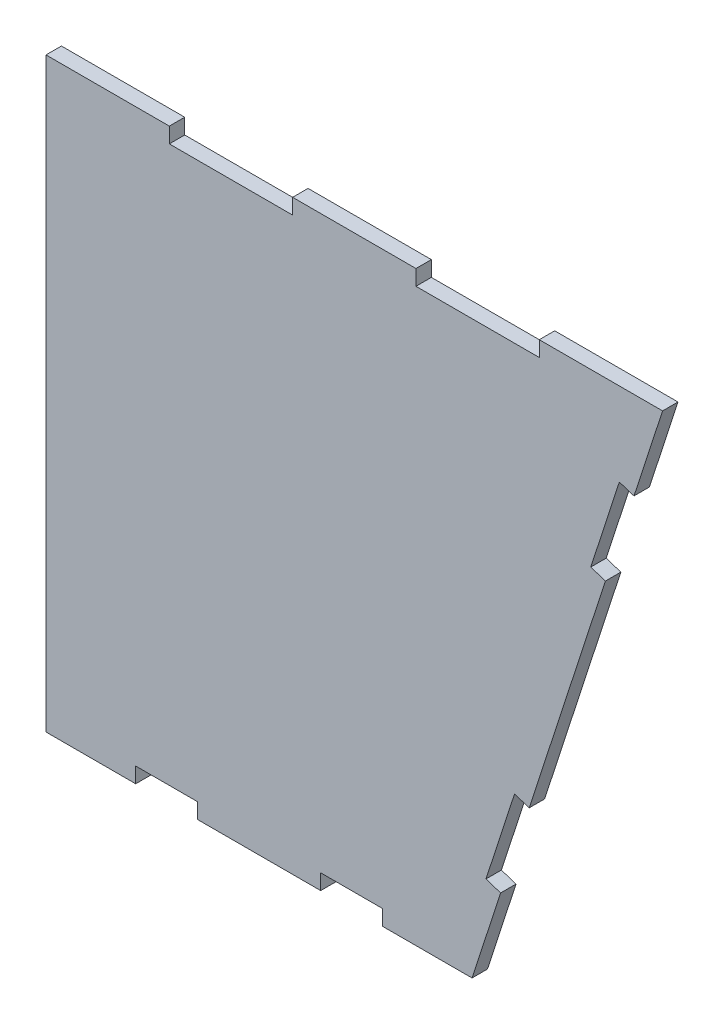
ISO-10303-21;
HEADER;
FILE_DESCRIPTION(('STEP AP214'),'2;1');
FILE_NAME('part.step','',(''),(''),'','','');
FILE_SCHEMA(('AUTOMOTIVE_DESIGN { 1 0 10303 214 1 1 1 1 }'));
ENDSEC;
DATA;
#1=APPLICATION_CONTEXT('core data for automotive mechanical design processes');
#2=APPLICATION_PROTOCOL_DEFINITION('international standard','automotive_design',2000,#1);
#3=PRODUCT_CONTEXT('',#1,'mechanical');
#4=PRODUCT('Part','Part','',(#3));
#5=PRODUCT_RELATED_PRODUCT_CATEGORY('part','',(#4));
#6=PRODUCT_DEFINITION_FORMATION('','',#4);
#7=PRODUCT_DEFINITION_CONTEXT('part definition',#1,'design');
#8=PRODUCT_DEFINITION('design','',#6,#7);
#9=PRODUCT_DEFINITION_SHAPE('','',#8);
#10=(LENGTH_UNIT() NAMED_UNIT(*) SI_UNIT(.MILLI.,.METRE.));
#11=(NAMED_UNIT(*) PLANE_ANGLE_UNIT() SI_UNIT($,.RADIAN.));
#12=(NAMED_UNIT(*) SI_UNIT($,.STERADIAN.) SOLID_ANGLE_UNIT());
#13=UNCERTAINTY_MEASURE_WITH_UNIT(LENGTH_MEASURE(1.E-05),#10,'distance_accuracy_value','');
#14=(GEOMETRIC_REPRESENTATION_CONTEXT(3) GLOBAL_UNCERTAINTY_ASSIGNED_CONTEXT((#13)) GLOBAL_UNIT_ASSIGNED_CONTEXT((#10,
#11,#12)) REPRESENTATION_CONTEXT('',''));
#15=CARTESIAN_POINT('',(0.,0.,0.));
#16=DIRECTION('',(0.,0.,1.));
#17=DIRECTION('',(1.,0.,0.));
#18=AXIS2_PLACEMENT_3D('',#15,#16,#17);
#19=CARTESIAN_POINT('',(-18.477420857191,0.,3.175));
#20=DIRECTION('',(0.,1.,0.));
#21=DIRECTION('',(0.,0.,1.));
#22=AXIS2_PLACEMENT_3D('',#19,#20,#21);
#23=PLANE('',#22);
#24=DIRECTION('',(1.,0.,0.));
#25=VECTOR('',#24,1.);
#26=CARTESIAN_POINT('',(-18.477420857191,0.,0.));
#27=LINE('',#26,#25);
#28=CARTESIAN_POINT('',(-18.477420857191,0.,0.));
#29=VERTEX_POINT('',#28);
#30=CARTESIAN_POINT('',(0.,0.,0.));
#31=VERTEX_POINT('',#30);
#32=EDGE_CURVE('E251',#29,#31,#27,.T.);
#33=ORIENTED_EDGE('',*,*,#32,.T.);
#34=DIRECTION('',(0.,0.,-1.));
#35=VECTOR('',#34,1.);
#36=CARTESIAN_POINT('',(0.,0.,3.175));
#37=LINE('',#36,#35);
#38=CARTESIAN_POINT('',(0.,0.,3.175));
#39=VERTEX_POINT('',#38);
#40=EDGE_CURVE('E11',#39,#31,#37,.T.);
#41=ORIENTED_EDGE('',*,*,#40,.F.);
#42=DIRECTION('',(1.,0.,0.));
#43=VECTOR('',#42,1.);
#44=CARTESIAN_POINT('',(-18.477420857191,0.,3.175));
#45=LINE('',#44,#43);
#46=CARTESIAN_POINT('',(-18.477420857191,0.,3.175));
#47=VERTEX_POINT('',#46);
#48=EDGE_CURVE('E305',#47,#39,#45,.T.);
#49=ORIENTED_EDGE('',*,*,#48,.F.);
#50=DIRECTION('',(0.,0.,-1.));
#51=VECTOR('',#50,1.);
#52=CARTESIAN_POINT('',(-18.477420857191,0.,3.175));
#53=LINE('',#52,#51);
#54=EDGE_CURVE('E247',#47,#29,#53,.T.);
#55=ORIENTED_EDGE('',*,*,#54,.T.);
#56=EDGE_LOOP('',(#33,#41,#49,#55));
#57=FACE_BOUND('',#56,.T.);
#58=ADVANCED_FACE('F35',(#57),#23,.F.);
#59=CARTESIAN_POINT('',(0.,0.,3.175));
#60=DIRECTION('',(-0.951056516295155,0.309016994374945,0.));
#61=DIRECTION('',(-0.309016994374945,-0.951056516295155,0.));
#62=AXIS2_PLACEMENT_3D('',#59,#60,#61);
#63=PLANE('',#62);
#64=DIRECTION('',(0.309016994374945,0.951056516295154,0.));
#65=VECTOR('',#64,1.);
#66=CARTESIAN_POINT('',(0.,0.,0.));
#67=LINE('',#66,#65);
#68=CARTESIAN_POINT('',(5.88677374284271,18.1176266354227,0.));
#69=VERTEX_POINT('',#68);
#70=EDGE_CURVE('E254',#31,#69,#67,.T.);
#71=ORIENTED_EDGE('',*,*,#70,.T.);
#72=DIRECTION('',(0.,0.,-1.));
#73=VECTOR('',#72,1.);
#74=CARTESIAN_POINT('',(5.88677374284271,18.1176266354227,3.175));
#75=LINE('',#74,#73);
#76=CARTESIAN_POINT('',(5.88677374284271,18.1176266354227,3.175));
#77=VERTEX_POINT('',#76);
#78=EDGE_CURVE('E43',#77,#69,#75,.T.);
#79=ORIENTED_EDGE('',*,*,#78,.F.);
#80=DIRECTION('',(0.309016994374945,0.951056516295154,0.));
#81=VECTOR('',#80,1.);
#82=CARTESIAN_POINT('',(0.,0.,3.175));
#83=LINE('',#82,#81);
#84=EDGE_CURVE('E154',#39,#77,#83,.T.);
#85=ORIENTED_EDGE('',*,*,#84,.F.);
#86=ORIENTED_EDGE('',*,*,#40,.T.);
#87=EDGE_LOOP('',(#71,#79,#85,#86));
#88=FACE_BOUND('',#87,.T.);
#89=ADVANCED_FACE('F463',(#88),#63,.F.);
#90=CARTESIAN_POINT('',(5.88677374284271,18.1176266354227,3.175));
#91=DIRECTION('',(-0.309016994374942,-0.951056516295155,0.));
#92=DIRECTION('',(0.951056516295155,-0.309016994374942,0.));
#93=AXIS2_PLACEMENT_3D('',#90,#91,#92);
#94=PLANE('',#93);
#95=DIRECTION('',(-0.951056516295155,0.309016994374942,0.));
#96=VECTOR('',#95,1.);
#97=CARTESIAN_POINT('',(5.88677374284271,18.1176266354227,0.));
#98=LINE('',#97,#96);
#99=CARTESIAN_POINT('',(2.86716930360559,19.0987555925632,0.));
#100=VERTEX_POINT('',#99);
#101=EDGE_CURVE('E256',#69,#100,#98,.T.);
#102=ORIENTED_EDGE('',*,*,#101,.T.);
#103=DIRECTION('',(0.,0.,-1.));
#104=VECTOR('',#103,1.);
#105=CARTESIAN_POINT('',(2.86716930360559,19.0987555925632,3.175));
#106=LINE('',#105,#104);
#107=CARTESIAN_POINT('',(2.86716930360559,19.0987555925632,3.175));
#108=VERTEX_POINT('',#107);
#109=EDGE_CURVE('E372',#108,#100,#106,.T.);
#110=ORIENTED_EDGE('',*,*,#109,.F.);
#111=DIRECTION('',(-0.951056516295155,0.309016994374942,0.));
#112=VECTOR('',#111,1.);
#113=CARTESIAN_POINT('',(5.88677374284271,18.1176266354227,3.175));
#114=LINE('',#113,#112);
#115=EDGE_CURVE('E380',#77,#108,#114,.T.);
#116=ORIENTED_EDGE('',*,*,#115,.F.);
#117=ORIENTED_EDGE('',*,*,#78,.T.);
#118=EDGE_LOOP('',(#102,#110,#116,#117));
#119=FACE_BOUND('',#118,.T.);
#120=ADVANCED_FACE('F378',(#119),#94,.F.);
#121=CARTESIAN_POINT('',(2.86716930360559,19.0987555925632,3.175));
#122=DIRECTION('',(-0.951056516295154,0.309016994374946,0.));
#123=DIRECTION('',(-0.309016994374946,-0.951056516295154,0.));
#124=AXIS2_PLACEMENT_3D('',#121,#122,#123);
#125=PLANE('',#124);
#126=DIRECTION('',(0.309016994374946,0.951056516295154,0.));
#127=VECTOR('',#126,1.);
#128=CARTESIAN_POINT('',(2.86716930360559,19.0987555925632,0.));
#129=LINE('',#128,#127);
#130=CARTESIAN_POINT('',(8.75394304644831,37.2163822279859,0.));
#131=VERTEX_POINT('',#130);
#132=EDGE_CURVE('E258',#100,#131,#129,.T.);
#133=ORIENTED_EDGE('',*,*,#132,.T.);
#134=DIRECTION('',(0.,0.,-1.));
#135=VECTOR('',#134,1.);
#136=CARTESIAN_POINT('',(8.75394304644831,37.2163822279859,3.175));
#137=LINE('',#136,#135);
#138=CARTESIAN_POINT('',(8.75394304644831,37.2163822279859,3.175));
#139=VERTEX_POINT('',#138);
#140=EDGE_CURVE('E369',#139,#131,#137,.T.);
#141=ORIENTED_EDGE('',*,*,#140,.F.);
#142=DIRECTION('',(0.309016994374946,0.951056516295154,0.));
#143=VECTOR('',#142,1.);
#144=CARTESIAN_POINT('',(2.86716930360559,19.0987555925632,3.175));
#145=LINE('',#144,#143);
#146=EDGE_CURVE('E398',#108,#139,#145,.T.);
#147=ORIENTED_EDGE('',*,*,#146,.F.);
#148=ORIENTED_EDGE('',*,*,#109,.T.);
#149=EDGE_LOOP('',(#133,#141,#147,#148));
#150=FACE_BOUND('',#149,.T.);
#151=ADVANCED_FACE('F389',(#150),#125,.F.);
#152=CARTESIAN_POINT('',(8.75394304644831,37.2163822279859,3.175));
#153=DIRECTION('',(0.309016994374942,0.951056516295155,0.));
#154=DIRECTION('',(-0.951056516295155,0.309016994374942,0.));
#155=AXIS2_PLACEMENT_3D('',#152,#153,#154);
#156=PLANE('',#155);
#157=DIRECTION('',(0.951056516295155,-0.309016994374942,0.));
#158=VECTOR('',#157,1.);
#159=CARTESIAN_POINT('',(8.75394304644831,37.2163822279859,0.));
#160=LINE('',#159,#158);
#161=CARTESIAN_POINT('',(11.7735474856854,36.2352532708454,0.));
#162=VERTEX_POINT('',#161);
#163=EDGE_CURVE('E260',#131,#162,#160,.T.);
#164=ORIENTED_EDGE('',*,*,#163,.T.);
#165=DIRECTION('',(0.,0.,-1.));
#166=VECTOR('',#165,1.);
#167=CARTESIAN_POINT('',(11.7735474856854,36.2352532708454,3.175));
#168=LINE('',#167,#166);
#169=CARTESIAN_POINT('',(11.7735474856854,36.2352532708454,3.175));
#170=VERTEX_POINT('',#169);
#171=EDGE_CURVE('E366',#170,#162,#168,.T.);
#172=ORIENTED_EDGE('',*,*,#171,.F.);
#173=DIRECTION('',(0.951056516295155,-0.309016994374942,0.));
#174=VECTOR('',#173,1.);
#175=CARTESIAN_POINT('',(8.75394304644831,37.2163822279859,3.175));
#176=LINE('',#175,#174);
#177=EDGE_CURVE('E395',#139,#170,#176,.T.);
#178=ORIENTED_EDGE('',*,*,#177,.F.);
#179=ORIENTED_EDGE('',*,*,#140,.T.);
#180=EDGE_LOOP('',(#164,#172,#178,#179));
#181=FACE_BOUND('',#180,.T.);
#182=ADVANCED_FACE('F393',(#181),#156,.F.);
#183=CARTESIAN_POINT('',(11.7735474856854,36.2352532708454,3.175));
#184=DIRECTION('',(-0.951056516295154,0.309016994374945,0.));
#185=DIRECTION('',(-0.309016994374945,-0.951056516295155,0.));
#186=AXIS2_PLACEMENT_3D('',#183,#184,#185);
#187=PLANE('',#186);
#188=DIRECTION('',(0.309016994374945,0.951056516295154,0.));
#189=VECTOR('',#188,1.);
#190=CARTESIAN_POINT('',(11.7735474856854,36.2352532708454,0.));
#191=LINE('',#190,#189);
#192=CARTESIAN_POINT('',(27.4716107999326,84.5489242986392,0.));
#193=VERTEX_POINT('',#192);
#194=EDGE_CURVE('E262',#162,#193,#191,.T.);
#195=ORIENTED_EDGE('',*,*,#194,.T.);
#196=DIRECTION('',(0.,0.,-1.));
#197=VECTOR('',#196,1.);
#198=CARTESIAN_POINT('',(27.4716107999326,84.5489242986392,3.175));
#199=LINE('',#198,#197);
#200=CARTESIAN_POINT('',(27.4716107999326,84.5489242986392,3.175));
#201=VERTEX_POINT('',#200);
#202=EDGE_CURVE('E363',#201,#193,#199,.T.);
#203=ORIENTED_EDGE('',*,*,#202,.F.);
#204=DIRECTION('',(0.309016994374945,0.951056516295154,0.));
#205=VECTOR('',#204,1.);
#206=CARTESIAN_POINT('',(11.7735474856854,36.2352532708454,3.175));
#207=LINE('',#206,#205);
#208=EDGE_CURVE('E397',#170,#201,#207,.T.);
#209=ORIENTED_EDGE('',*,*,#208,.F.);
#210=ORIENTED_EDGE('',*,*,#171,.T.);
#211=EDGE_LOOP('',(#195,#203,#209,#210));
#212=FACE_BOUND('',#211,.T.);
#213=ADVANCED_FACE('F476',(#212),#187,.F.);
#214=CARTESIAN_POINT('',(24.4520063606954,85.5300532557797,3.175));
#215=DIRECTION('',(-0.309016994374945,-0.951056516295154,0.));
#216=DIRECTION('',(0.951056516295154,-0.309016994374945,0.));
#217=AXIS2_PLACEMENT_3D('',#214,#215,#216);
#218=PLANE('',#217);
#219=DIRECTION('',(-0.951056516295154,0.309016994374945,0.));
#220=VECTOR('',#219,1.);
#221=CARTESIAN_POINT('',(24.4520063606954,85.5300532557797,0.));
#222=LINE('',#221,#220);
#223=CARTESIAN_POINT('',(24.4520063606954,85.5300532557797,0.));
#224=VERTEX_POINT('',#223);
#225=EDGE_CURVE('E264',#193,#224,#222,.T.);
#226=ORIENTED_EDGE('',*,*,#225,.T.);
#227=DIRECTION('',(0.,0.,-1.));
#228=VECTOR('',#227,1.);
#229=CARTESIAN_POINT('',(24.4520063606954,85.5300532557797,3.175));
#230=LINE('',#229,#228);
#231=CARTESIAN_POINT('',(24.4520063606954,85.5300532557797,3.175));
#232=VERTEX_POINT('',#231);
#233=EDGE_CURVE('E360',#232,#224,#230,.T.);
#234=ORIENTED_EDGE('',*,*,#233,.F.);
#235=DIRECTION('',(-0.951056516295154,0.309016994374945,0.));
#236=VECTOR('',#235,1.);
#237=CARTESIAN_POINT('',(24.4520063606954,85.5300532557797,3.175));
#238=LINE('',#237,#236);
#239=EDGE_CURVE('E400',#201,#232,#238,.T.);
#240=ORIENTED_EDGE('',*,*,#239,.F.);
#241=ORIENTED_EDGE('',*,*,#202,.T.);
#242=EDGE_LOOP('',(#226,#234,#240,#241));
#243=FACE_BOUND('',#242,.T.);
#244=ADVANCED_FACE('F479',(#243),#218,.F.);
#245=CARTESIAN_POINT('',(30.3387801035381,103.647679891202,3.175));
#246=DIRECTION('',(-0.951056516295154,0.309016994374945,0.));
#247=DIRECTION('',(-0.309016994374945,-0.951056516295155,0.));
#248=AXIS2_PLACEMENT_3D('',#245,#246,#247);
#249=PLANE('',#248);
#250=DIRECTION('',(0.309016994374945,0.951056516295154,0.));
#251=VECTOR('',#250,1.);
#252=CARTESIAN_POINT('',(30.3387801035381,103.647679891202,0.));
#253=LINE('',#252,#251);
#254=CARTESIAN_POINT('',(30.3387801035381,103.647679891202,0.));
#255=VERTEX_POINT('',#254);
#256=EDGE_CURVE('E266',#224,#255,#253,.T.);
#257=ORIENTED_EDGE('',*,*,#256,.T.);
#258=DIRECTION('',(0.,0.,-1.));
#259=VECTOR('',#258,1.);
#260=CARTESIAN_POINT('',(30.3387801035381,103.647679891202,3.175));
#261=LINE('',#260,#259);
#262=CARTESIAN_POINT('',(30.3387801035381,103.647679891202,3.175));
#263=VERTEX_POINT('',#262);
#264=EDGE_CURVE('E357',#263,#255,#261,.T.);
#265=ORIENTED_EDGE('',*,*,#264,.F.);
#266=DIRECTION('',(0.309016994374945,0.951056516295154,0.));
#267=VECTOR('',#266,1.);
#268=CARTESIAN_POINT('',(30.3387801035381,103.647679891202,3.175));
#269=LINE('',#268,#267);
#270=EDGE_CURVE('E406',#232,#263,#269,.T.);
#271=ORIENTED_EDGE('',*,*,#270,.F.);
#272=ORIENTED_EDGE('',*,*,#233,.T.);
#273=EDGE_LOOP('',(#257,#265,#271,#272));
#274=FACE_BOUND('',#273,.T.);
#275=ADVANCED_FACE('F483',(#274),#249,.F.);
#276=CARTESIAN_POINT('',(33.3583845427753,102.666550934062,3.175));
#277=DIRECTION('',(0.309016994374944,0.951056516295155,0.));
#278=DIRECTION('',(-0.951056516295155,0.309016994374944,0.));
#279=AXIS2_PLACEMENT_3D('',#276,#277,#278);
#280=PLANE('',#279);
#281=DIRECTION('',(0.951056516295155,-0.309016994374944,0.));
#282=VECTOR('',#281,1.);
#283=CARTESIAN_POINT('',(33.3583845427753,102.666550934062,0.));
#284=LINE('',#283,#282);
#285=CARTESIAN_POINT('',(33.3583845427753,102.666550934062,0.));
#286=VERTEX_POINT('',#285);
#287=EDGE_CURVE('E268',#255,#286,#284,.T.);
#288=ORIENTED_EDGE('',*,*,#287,.T.);
#289=DIRECTION('',(0.,0.,-1.));
#290=VECTOR('',#289,1.);
#291=CARTESIAN_POINT('',(33.3583845427753,102.666550934062,3.175));
#292=LINE('',#291,#290);
#293=CARTESIAN_POINT('',(33.3583845427753,102.666550934062,3.175));
#294=VERTEX_POINT('',#293);
#295=EDGE_CURVE('E354',#294,#286,#292,.T.);
#296=ORIENTED_EDGE('',*,*,#295,.F.);
#297=DIRECTION('',(0.951056516295155,-0.309016994374944,0.));
#298=VECTOR('',#297,1.);
#299=CARTESIAN_POINT('',(33.3583845427753,102.666550934062,3.175));
#300=LINE('',#299,#298);
#301=EDGE_CURVE('E408',#263,#294,#300,.T.);
#302=ORIENTED_EDGE('',*,*,#301,.F.);
#303=ORIENTED_EDGE('',*,*,#264,.T.);
#304=EDGE_LOOP('',(#288,#296,#302,#303));
#305=FACE_BOUND('',#304,.T.);
#306=ADVANCED_FACE('F487',(#305),#280,.F.);
#307=CARTESIAN_POINT('',(33.3583845427753,102.666550934062,3.175));
#308=DIRECTION('',(-0.951056516295154,0.309016994374946,0.));
#309=DIRECTION('',(-0.309016994374946,-0.951056516295154,0.));
#310=AXIS2_PLACEMENT_3D('',#307,#308,#309);
#311=PLANE('',#310);
#312=DIRECTION('',(0.309016994374946,0.951056516295154,0.));
#313=VECTOR('',#312,1.);
#314=CARTESIAN_POINT('',(33.3583845427753,102.666550934062,0.));
#315=LINE('',#314,#313);
#316=CARTESIAN_POINT('',(39.245158285618,120.784177569485,0.));
#317=VERTEX_POINT('',#316);
#318=EDGE_CURVE('E270',#286,#317,#315,.T.);
#319=ORIENTED_EDGE('',*,*,#318,.T.);
#320=DIRECTION('',(0.,0.,-1.));
#321=VECTOR('',#320,1.);
#322=CARTESIAN_POINT('',(39.245158285618,120.784177569485,3.175));
#323=LINE('',#322,#321);
#324=CARTESIAN_POINT('',(39.245158285618,120.784177569485,3.175));
#325=VERTEX_POINT('',#324);
#326=EDGE_CURVE('E351',#325,#317,#323,.T.);
#327=ORIENTED_EDGE('',*,*,#326,.F.);
#328=DIRECTION('',(0.309016994374946,0.951056516295154,0.));
#329=VECTOR('',#328,1.);
#330=CARTESIAN_POINT('',(33.3583845427753,102.666550934062,3.175));
#331=LINE('',#330,#329);
#332=EDGE_CURVE('E410',#294,#325,#331,.T.);
#333=ORIENTED_EDGE('',*,*,#332,.F.);
#334=ORIENTED_EDGE('',*,*,#295,.T.);
#335=EDGE_LOOP('',(#319,#327,#333,#334));
#336=FACE_BOUND('',#335,.T.);
#337=ADVANCED_FACE('F491',(#336),#311,.F.);
#338=CARTESIAN_POINT('',(39.245158285618,120.784177569485,3.175));
#339=DIRECTION('',(0.,-1.,0.));
#340=DIRECTION('',(1.,0.,0.));
#341=AXIS2_PLACEMENT_3D('',#338,#339,#340);
#342=PLANE('',#341);
#343=DIRECTION('',(-1.,0.,0.));
#344=VECTOR('',#343,1.);
#345=CARTESIAN_POINT('',(39.245158285618,120.784177569485,0.));
#346=LINE('',#345,#344);
#347=CARTESIAN_POINT('',(13.845158285618,120.784177569485,0.));
#348=VERTEX_POINT('',#347);
#349=EDGE_CURVE('E272',#317,#348,#346,.T.);
#350=ORIENTED_EDGE('',*,*,#349,.T.);
#351=DIRECTION('',(0.,0.,-1.));
#352=VECTOR('',#351,1.);
#353=CARTESIAN_POINT('',(13.845158285618,120.784177569485,3.175));
#354=LINE('',#353,#352);
#355=CARTESIAN_POINT('',(13.845158285618,120.784177569485,3.175));
#356=VERTEX_POINT('',#355);
#357=EDGE_CURVE('E348',#356,#348,#354,.T.);
#358=ORIENTED_EDGE('',*,*,#357,.F.);
#359=DIRECTION('',(-1.,0.,0.));
#360=VECTOR('',#359,1.);
#361=CARTESIAN_POINT('',(39.245158285618,120.784177569485,3.175));
#362=LINE('',#361,#360);
#363=EDGE_CURVE('E412',#325,#356,#362,.T.);
#364=ORIENTED_EDGE('',*,*,#363,.F.);
#365=ORIENTED_EDGE('',*,*,#326,.T.);
#366=EDGE_LOOP('',(#350,#358,#364,#365));
#367=FACE_BOUND('',#366,.T.);
#368=ADVANCED_FACE('F495',(#367),#342,.F.);
#369=CARTESIAN_POINT('',(13.845158285618,120.784177569485,3.175));
#370=DIRECTION('',(1.,0.,0.));
#371=DIRECTION('',(0.,0.,-1.));
#372=AXIS2_PLACEMENT_3D('',#369,#370,#371);
#373=PLANE('',#372);
#374=DIRECTION('',(0.,-1.,0.));
#375=VECTOR('',#374,1.);
#376=CARTESIAN_POINT('',(13.845158285618,120.784177569485,0.));
#377=LINE('',#376,#375);
#378=CARTESIAN_POINT('',(13.845158285618,117.609177569485,0.));
#379=VERTEX_POINT('',#378);
#380=EDGE_CURVE('E274',#348,#379,#377,.T.);
#381=ORIENTED_EDGE('',*,*,#380,.T.);
#382=DIRECTION('',(0.,0.,-1.));
#383=VECTOR('',#382,1.);
#384=CARTESIAN_POINT('',(13.845158285618,117.609177569485,3.175));
#385=LINE('',#384,#383);
#386=CARTESIAN_POINT('',(13.845158285618,117.609177569485,3.175));
#387=VERTEX_POINT('',#386);
#388=EDGE_CURVE('E345',#387,#379,#385,.T.);
#389=ORIENTED_EDGE('',*,*,#388,.F.);
#390=DIRECTION('',(0.,-1.,0.));
#391=VECTOR('',#390,1.);
#392=CARTESIAN_POINT('',(13.845158285618,120.784177569485,3.175));
#393=LINE('',#392,#391);
#394=EDGE_CURVE('E414',#356,#387,#393,.T.);
#395=ORIENTED_EDGE('',*,*,#394,.F.);
#396=ORIENTED_EDGE('',*,*,#357,.T.);
#397=EDGE_LOOP('',(#381,#389,#395,#396));
#398=FACE_BOUND('',#397,.T.);
#399=ADVANCED_FACE('F499',(#398),#373,.F.);
#400=CARTESIAN_POINT('',(13.845158285618,117.609177569485,3.175));
#401=DIRECTION('',(0.,-1.,0.));
#402=DIRECTION('',(1.,0.,0.));
#403=AXIS2_PLACEMENT_3D('',#400,#401,#402);
#404=PLANE('',#403);
#405=DIRECTION('',(-1.,0.,0.));
#406=VECTOR('',#405,1.);
#407=CARTESIAN_POINT('',(13.845158285618,117.609177569485,0.));
#408=LINE('',#407,#406);
#409=CARTESIAN_POINT('',(-11.554841714382,117.609177569485,0.));
#410=VERTEX_POINT('',#409);
#411=EDGE_CURVE('E276',#379,#410,#408,.T.);
#412=ORIENTED_EDGE('',*,*,#411,.T.);
#413=DIRECTION('',(0.,0.,-1.));
#414=VECTOR('',#413,1.);
#415=CARTESIAN_POINT('',(-11.554841714382,117.609177569485,3.175));
#416=LINE('',#415,#414);
#417=CARTESIAN_POINT('',(-11.554841714382,117.609177569485,3.175));
#418=VERTEX_POINT('',#417);
#419=EDGE_CURVE('E342',#418,#410,#416,.T.);
#420=ORIENTED_EDGE('',*,*,#419,.F.);
#421=DIRECTION('',(-1.,0.,0.));
#422=VECTOR('',#421,1.);
#423=CARTESIAN_POINT('',(13.845158285618,117.609177569485,3.175));
#424=LINE('',#423,#422);
#425=EDGE_CURVE('E416',#387,#418,#424,.T.);
#426=ORIENTED_EDGE('',*,*,#425,.F.);
#427=ORIENTED_EDGE('',*,*,#388,.T.);
#428=EDGE_LOOP('',(#412,#420,#426,#427));
#429=FACE_BOUND('',#428,.T.);
#430=ADVANCED_FACE('F503',(#429),#404,.F.);
#431=CARTESIAN_POINT('',(-11.554841714382,117.609177569485,3.175));
#432=DIRECTION('',(-1.,0.,0.));
#433=DIRECTION('',(0.,0.,1.));
#434=AXIS2_PLACEMENT_3D('',#431,#432,#433);
#435=PLANE('',#434);
#436=DIRECTION('',(0.,1.,0.));
#437=VECTOR('',#436,1.);
#438=CARTESIAN_POINT('',(-11.554841714382,117.609177569485,0.));
#439=LINE('',#438,#437);
#440=CARTESIAN_POINT('',(-11.554841714382,120.784177569485,0.));
#441=VERTEX_POINT('',#440);
#442=EDGE_CURVE('E278',#410,#441,#439,.T.);
#443=ORIENTED_EDGE('',*,*,#442,.T.);
#444=DIRECTION('',(0.,0.,-1.));
#445=VECTOR('',#444,1.);
#446=CARTESIAN_POINT('',(-11.554841714382,120.784177569485,3.175));
#447=LINE('',#446,#445);
#448=CARTESIAN_POINT('',(-11.554841714382,120.784177569485,3.175));
#449=VERTEX_POINT('',#448);
#450=EDGE_CURVE('E339',#449,#441,#447,.T.);
#451=ORIENTED_EDGE('',*,*,#450,.F.);
#452=DIRECTION('',(0.,1.,0.));
#453=VECTOR('',#452,1.);
#454=CARTESIAN_POINT('',(-11.554841714382,117.609177569485,3.175));
#455=LINE('',#454,#453);
#456=EDGE_CURVE('E418',#418,#449,#455,.T.);
#457=ORIENTED_EDGE('',*,*,#456,.F.);
#458=ORIENTED_EDGE('',*,*,#419,.T.);
#459=EDGE_LOOP('',(#443,#451,#457,#458));
#460=FACE_BOUND('',#459,.T.);
#461=ADVANCED_FACE('F507',(#460),#435,.F.);
#462=CARTESIAN_POINT('',(-11.554841714382,120.784177569485,3.175));
#463=DIRECTION('',(0.,-1.,0.));
#464=DIRECTION('',(0.,0.,-1.));
#465=AXIS2_PLACEMENT_3D('',#462,#463,#464);
#466=PLANE('',#465);
#467=DIRECTION('',(-1.,0.,0.));
#468=VECTOR('',#467,1.);
#469=CARTESIAN_POINT('',(-11.554841714382,120.784177569485,0.));
#470=LINE('',#469,#468);
#471=CARTESIAN_POINT('',(-36.954841714382,120.784177569485,0.));
#472=VERTEX_POINT('',#471);
#473=EDGE_CURVE('E280',#441,#472,#470,.T.);
#474=ORIENTED_EDGE('',*,*,#473,.T.);
#475=DIRECTION('',(0.,0.,-1.));
#476=VECTOR('',#475,1.);
#477=CARTESIAN_POINT('',(-36.954841714382,120.784177569485,3.175));
#478=LINE('',#477,#476);
#479=CARTESIAN_POINT('',(-36.954841714382,120.784177569485,3.175));
#480=VERTEX_POINT('',#479);
#481=EDGE_CURVE('E336',#480,#472,#478,.T.);
#482=ORIENTED_EDGE('',*,*,#481,.F.);
#483=DIRECTION('',(-1.,0.,0.));
#484=VECTOR('',#483,1.);
#485=CARTESIAN_POINT('',(-11.554841714382,120.784177569485,3.175));
#486=LINE('',#485,#484);
#487=EDGE_CURVE('E420',#449,#480,#486,.T.);
#488=ORIENTED_EDGE('',*,*,#487,.F.);
#489=ORIENTED_EDGE('',*,*,#450,.T.);
#490=EDGE_LOOP('',(#474,#482,#488,#489));
#491=FACE_BOUND('',#490,.T.);
#492=ADVANCED_FACE('F511',(#491),#466,.F.);
#493=CARTESIAN_POINT('',(-36.954841714382,117.609177569485,3.175));
#494=DIRECTION('',(1.,0.,0.));
#495=DIRECTION('',(0.,0.,-1.));
#496=AXIS2_PLACEMENT_3D('',#493,#494,#495);
#497=PLANE('',#496);
#498=DIRECTION('',(0.,-1.,0.));
#499=VECTOR('',#498,1.);
#500=CARTESIAN_POINT('',(-36.954841714382,117.609177569485,0.));
#501=LINE('',#500,#499);
#502=CARTESIAN_POINT('',(-36.954841714382,117.609177569485,0.));
#503=VERTEX_POINT('',#502);
#504=EDGE_CURVE('E282',#472,#503,#501,.T.);
#505=ORIENTED_EDGE('',*,*,#504,.T.);
#506=DIRECTION('',(0.,0.,-1.));
#507=VECTOR('',#506,1.);
#508=CARTESIAN_POINT('',(-36.954841714382,117.609177569485,3.175));
#509=LINE('',#508,#507);
#510=CARTESIAN_POINT('',(-36.954841714382,117.609177569485,3.175));
#511=VERTEX_POINT('',#510);
#512=EDGE_CURVE('E333',#511,#503,#509,.T.);
#513=ORIENTED_EDGE('',*,*,#512,.F.);
#514=DIRECTION('',(0.,-1.,0.));
#515=VECTOR('',#514,1.);
#516=CARTESIAN_POINT('',(-36.954841714382,117.609177569485,3.175));
#517=LINE('',#516,#515);
#518=EDGE_CURVE('E422',#480,#511,#517,.T.);
#519=ORIENTED_EDGE('',*,*,#518,.F.);
#520=ORIENTED_EDGE('',*,*,#481,.T.);
#521=EDGE_LOOP('',(#505,#513,#519,#520));
#522=FACE_BOUND('',#521,.T.);
#523=ADVANCED_FACE('F515',(#522),#497,.F.);
#524=CARTESIAN_POINT('',(-62.354841714382,117.609177569485,3.175));
#525=DIRECTION('',(0.,-1.,0.));
#526=DIRECTION('',(0.,0.,-1.));
#527=AXIS2_PLACEMENT_3D('',#524,#525,#526);
#528=PLANE('',#527);
#529=DIRECTION('',(-1.,0.,0.));
#530=VECTOR('',#529,1.);
#531=CARTESIAN_POINT('',(-62.354841714382,117.609177569485,0.));
#532=LINE('',#531,#530);
#533=CARTESIAN_POINT('',(-62.354841714382,117.609177569485,0.));
#534=VERTEX_POINT('',#533);
#535=EDGE_CURVE('E284',#503,#534,#532,.T.);
#536=ORIENTED_EDGE('',*,*,#535,.T.);
#537=DIRECTION('',(0.,0.,-1.));
#538=VECTOR('',#537,1.);
#539=CARTESIAN_POINT('',(-62.354841714382,117.609177569485,3.175));
#540=LINE('',#539,#538);
#541=CARTESIAN_POINT('',(-62.354841714382,117.609177569485,3.175));
#542=VERTEX_POINT('',#541);
#543=EDGE_CURVE('E330',#542,#534,#540,.T.);
#544=ORIENTED_EDGE('',*,*,#543,.F.);
#545=DIRECTION('',(-1.,0.,0.));
#546=VECTOR('',#545,1.);
#547=CARTESIAN_POINT('',(-62.354841714382,117.609177569485,3.175));
#548=LINE('',#547,#546);
#549=EDGE_CURVE('E424',#511,#542,#548,.T.);
#550=ORIENTED_EDGE('',*,*,#549,.F.);
#551=ORIENTED_EDGE('',*,*,#512,.T.);
#552=EDGE_LOOP('',(#536,#544,#550,#551));
#553=FACE_BOUND('',#552,.T.);
#554=ADVANCED_FACE('F519',(#553),#528,.F.);
#555=CARTESIAN_POINT('',(-62.354841714382,120.784177569485,3.175));
#556=DIRECTION('',(-1.,0.,0.));
#557=DIRECTION('',(0.,0.,1.));
#558=AXIS2_PLACEMENT_3D('',#555,#556,#557);
#559=PLANE('',#558);
#560=DIRECTION('',(0.,1.,0.));
#561=VECTOR('',#560,1.);
#562=CARTESIAN_POINT('',(-62.354841714382,120.784177569485,0.));
#563=LINE('',#562,#561);
#564=CARTESIAN_POINT('',(-62.354841714382,120.784177569485,0.));
#565=VERTEX_POINT('',#564);
#566=EDGE_CURVE('E286',#534,#565,#563,.T.);
#567=ORIENTED_EDGE('',*,*,#566,.T.);
#568=DIRECTION('',(0.,0.,-1.));
#569=VECTOR('',#568,1.);
#570=CARTESIAN_POINT('',(-62.354841714382,120.784177569485,3.175));
#571=LINE('',#570,#569);
#572=CARTESIAN_POINT('',(-62.354841714382,120.784177569485,3.175));
#573=VERTEX_POINT('',#572);
#574=EDGE_CURVE('E327',#573,#565,#571,.T.);
#575=ORIENTED_EDGE('',*,*,#574,.F.);
#576=DIRECTION('',(0.,1.,0.));
#577=VECTOR('',#576,1.);
#578=CARTESIAN_POINT('',(-62.354841714382,120.784177569485,3.175));
#579=LINE('',#578,#577);
#580=EDGE_CURVE('E426',#542,#573,#579,.T.);
#581=ORIENTED_EDGE('',*,*,#580,.F.);
#582=ORIENTED_EDGE('',*,*,#543,.T.);
#583=EDGE_LOOP('',(#567,#575,#581,#582));
#584=FACE_BOUND('',#583,.T.);
#585=ADVANCED_FACE('F523',(#584),#559,.F.);
#586=CARTESIAN_POINT('',(-62.354841714382,120.784177569485,3.175));
#587=DIRECTION('',(0.,-1.,0.));
#588=DIRECTION('',(1.,0.,0.));
#589=AXIS2_PLACEMENT_3D('',#586,#587,#588);
#590=PLANE('',#589);
#591=DIRECTION('',(-1.,0.,0.));
#592=VECTOR('',#591,1.);
#593=CARTESIAN_POINT('',(-62.354841714382,120.784177569485,0.));
#594=LINE('',#593,#592);
#595=CARTESIAN_POINT('',(-87.754841714382,120.784177569485,0.));
#596=VERTEX_POINT('',#595);
#597=EDGE_CURVE('E288',#565,#596,#594,.T.);
#598=ORIENTED_EDGE('',*,*,#597,.T.);
#599=DIRECTION('',(0.,0.,-1.));
#600=VECTOR('',#599,1.);
#601=CARTESIAN_POINT('',(-87.754841714382,120.784177569485,3.175));
#602=LINE('',#601,#600);
#603=CARTESIAN_POINT('',(-87.754841714382,120.784177569485,3.175));
#604=VERTEX_POINT('',#603);
#605=EDGE_CURVE('E324',#604,#596,#602,.T.);
#606=ORIENTED_EDGE('',*,*,#605,.F.);
#607=DIRECTION('',(-1.,0.,0.));
#608=VECTOR('',#607,1.);
#609=CARTESIAN_POINT('',(-62.354841714382,120.784177569485,3.175));
#610=LINE('',#609,#608);
#611=EDGE_CURVE('E428',#573,#604,#610,.T.);
#612=ORIENTED_EDGE('',*,*,#611,.F.);
#613=ORIENTED_EDGE('',*,*,#574,.T.);
#614=EDGE_LOOP('',(#598,#606,#612,#613));
#615=FACE_BOUND('',#614,.T.);
#616=ADVANCED_FACE('F527',(#615),#590,.F.);
#617=CARTESIAN_POINT('',(-87.754841714382,120.784177569485,3.175));
#618=DIRECTION('',(1.,0.,0.));
#619=DIRECTION('',(0.,1.,0.));
#620=AXIS2_PLACEMENT_3D('',#617,#618,#619);
#621=PLANE('',#620);
#622=DIRECTION('',(0.,-1.,0.));
#623=VECTOR('',#622,1.);
#624=CARTESIAN_POINT('',(-87.754841714382,120.784177569485,0.));
#625=LINE('',#624,#623);
#626=CARTESIAN_POINT('',(-87.754841714382,0.,0.));
#627=VERTEX_POINT('',#626);
#628=EDGE_CURVE('E290',#596,#627,#625,.T.);
#629=ORIENTED_EDGE('',*,*,#628,.T.);
#630=DIRECTION('',(0.,0.,-1.));
#631=VECTOR('',#630,1.);
#632=CARTESIAN_POINT('',(-87.754841714382,0.,3.175));
#633=LINE('',#632,#631);
#634=CARTESIAN_POINT('',(-87.754841714382,0.,3.175));
#635=VERTEX_POINT('',#634);
#636=EDGE_CURVE('E321',#635,#627,#633,.T.);
#637=ORIENTED_EDGE('',*,*,#636,.F.);
#638=DIRECTION('',(0.,-1.,0.));
#639=VECTOR('',#638,1.);
#640=CARTESIAN_POINT('',(-87.754841714382,120.784177569485,3.175));
#641=LINE('',#640,#639);
#642=EDGE_CURVE('E430',#604,#635,#641,.T.);
#643=ORIENTED_EDGE('',*,*,#642,.F.);
#644=ORIENTED_EDGE('',*,*,#605,.T.);
#645=EDGE_LOOP('',(#629,#637,#643,#644));
#646=FACE_BOUND('',#645,.T.);
#647=ADVANCED_FACE('F531',(#646),#621,.F.);
#648=CARTESIAN_POINT('',(-87.754841714382,0.,3.175));
#649=DIRECTION('',(0.,1.,0.));
#650=DIRECTION('',(0.,0.,1.));
#651=AXIS2_PLACEMENT_3D('',#648,#649,#650);
#652=PLANE('',#651);
#653=DIRECTION('',(1.,0.,0.));
#654=VECTOR('',#653,1.);
#655=CARTESIAN_POINT('',(-87.754841714382,0.,0.));
#656=LINE('',#655,#654);
#657=CARTESIAN_POINT('',(-69.277420857191,0.,0.));
#658=VERTEX_POINT('',#657);
#659=EDGE_CURVE('E292',#627,#658,#656,.T.);
#660=ORIENTED_EDGE('',*,*,#659,.T.);
#661=DIRECTION('',(0.,0.,-1.));
#662=VECTOR('',#661,1.);
#663=CARTESIAN_POINT('',(-69.277420857191,0.,3.175));
#664=LINE('',#663,#662);
#665=CARTESIAN_POINT('',(-69.277420857191,0.,3.175));
#666=VERTEX_POINT('',#665);
#667=EDGE_CURVE('E318',#666,#658,#664,.T.);
#668=ORIENTED_EDGE('',*,*,#667,.F.);
#669=DIRECTION('',(1.,0.,0.));
#670=VECTOR('',#669,1.);
#671=CARTESIAN_POINT('',(-87.754841714382,0.,3.175));
#672=LINE('',#671,#670);
#673=EDGE_CURVE('E432',#635,#666,#672,.T.);
#674=ORIENTED_EDGE('',*,*,#673,.F.);
#675=ORIENTED_EDGE('',*,*,#636,.T.);
#676=EDGE_LOOP('',(#660,#668,#674,#675));
#677=FACE_BOUND('',#676,.T.);
#678=ADVANCED_FACE('F535',(#677),#652,.F.);
#679=CARTESIAN_POINT('',(-69.277420857191,0.,3.175));
#680=DIRECTION('',(-1.,0.,0.));
#681=DIRECTION('',(0.,0.,1.));
#682=AXIS2_PLACEMENT_3D('',#679,#680,#681);
#683=PLANE('',#682);
#684=DIRECTION('',(0.,1.,0.));
#685=VECTOR('',#684,1.);
#686=CARTESIAN_POINT('',(-69.277420857191,0.,0.));
#687=LINE('',#686,#685);
#688=CARTESIAN_POINT('',(-69.277420857191,3.175,0.));
#689=VERTEX_POINT('',#688);
#690=EDGE_CURVE('E294',#658,#689,#687,.T.);
#691=ORIENTED_EDGE('',*,*,#690,.T.);
#692=DIRECTION('',(0.,0.,-1.));
#693=VECTOR('',#692,1.);
#694=CARTESIAN_POINT('',(-69.277420857191,3.175,3.175));
#695=LINE('',#694,#693);
#696=CARTESIAN_POINT('',(-69.277420857191,3.175,3.175));
#697=VERTEX_POINT('',#696);
#698=EDGE_CURVE('E315',#697,#689,#695,.T.);
#699=ORIENTED_EDGE('',*,*,#698,.F.);
#700=DIRECTION('',(0.,1.,0.));
#701=VECTOR('',#700,1.);
#702=CARTESIAN_POINT('',(-69.277420857191,0.,3.175));
#703=LINE('',#702,#701);
#704=EDGE_CURVE('E434',#666,#697,#703,.T.);
#705=ORIENTED_EDGE('',*,*,#704,.F.);
#706=ORIENTED_EDGE('',*,*,#667,.T.);
#707=EDGE_LOOP('',(#691,#699,#705,#706));
#708=FACE_BOUND('',#707,.T.);
#709=ADVANCED_FACE('F539',(#708),#683,.F.);
#710=CARTESIAN_POINT('',(-69.277420857191,3.175,3.175));
#711=DIRECTION('',(0.,1.,0.));
#712=DIRECTION('',(-1.,0.,0.));
#713=AXIS2_PLACEMENT_3D('',#710,#711,#712);
#714=PLANE('',#713);
#715=DIRECTION('',(1.,0.,0.));
#716=VECTOR('',#715,1.);
#717=CARTESIAN_POINT('',(-69.277420857191,3.175,0.));
#718=LINE('',#717,#716);
#719=CARTESIAN_POINT('',(-56.577420857191,3.175,0.));
#720=VERTEX_POINT('',#719);
#721=EDGE_CURVE('E296',#689,#720,#718,.T.);
#722=ORIENTED_EDGE('',*,*,#721,.T.);
#723=DIRECTION('',(0.,0.,-1.));
#724=VECTOR('',#723,1.);
#725=CARTESIAN_POINT('',(-56.577420857191,3.175,3.175));
#726=LINE('',#725,#724);
#727=CARTESIAN_POINT('',(-56.577420857191,3.175,3.175));
#728=VERTEX_POINT('',#727);
#729=EDGE_CURVE('E312',#728,#720,#726,.T.);
#730=ORIENTED_EDGE('',*,*,#729,.F.);
#731=DIRECTION('',(1.,0.,0.));
#732=VECTOR('',#731,1.);
#733=CARTESIAN_POINT('',(-69.277420857191,3.175,3.175));
#734=LINE('',#733,#732);
#735=EDGE_CURVE('E436',#697,#728,#734,.T.);
#736=ORIENTED_EDGE('',*,*,#735,.F.);
#737=ORIENTED_EDGE('',*,*,#698,.T.);
#738=EDGE_LOOP('',(#722,#730,#736,#737));
#739=FACE_BOUND('',#738,.T.);
#740=ADVANCED_FACE('F543',(#739),#714,.F.);
#741=CARTESIAN_POINT('',(-56.577420857191,3.175,3.175));
#742=DIRECTION('',(1.,0.,0.));
#743=DIRECTION('',(0.,0.,-1.));
#744=AXIS2_PLACEMENT_3D('',#741,#742,#743);
#745=PLANE('',#744);
#746=DIRECTION('',(0.,-1.,0.));
#747=VECTOR('',#746,1.);
#748=CARTESIAN_POINT('',(-56.577420857191,3.175,0.));
#749=LINE('',#748,#747);
#750=CARTESIAN_POINT('',(-56.577420857191,0.,0.));
#751=VERTEX_POINT('',#750);
#752=EDGE_CURVE('E298',#720,#751,#749,.T.);
#753=ORIENTED_EDGE('',*,*,#752,.T.);
#754=DIRECTION('',(0.,0.,-1.));
#755=VECTOR('',#754,1.);
#756=CARTESIAN_POINT('',(-56.577420857191,0.,3.175));
#757=LINE('',#756,#755);
#758=CARTESIAN_POINT('',(-56.577420857191,0.,3.175));
#759=VERTEX_POINT('',#758);
#760=EDGE_CURVE('E309',#759,#751,#757,.T.);
#761=ORIENTED_EDGE('',*,*,#760,.F.);
#762=DIRECTION('',(0.,-1.,0.));
#763=VECTOR('',#762,1.);
#764=CARTESIAN_POINT('',(-56.577420857191,3.175,3.175));
#765=LINE('',#764,#763);
#766=EDGE_CURVE('E438',#728,#759,#765,.T.);
#767=ORIENTED_EDGE('',*,*,#766,.F.);
#768=ORIENTED_EDGE('',*,*,#729,.T.);
#769=EDGE_LOOP('',(#753,#761,#767,#768));
#770=FACE_BOUND('',#769,.T.);
#771=ADVANCED_FACE('F444',(#770),#745,.F.);
#772=CARTESIAN_POINT('',(-56.577420857191,0.,3.175));
#773=DIRECTION('',(0.,1.,0.));
#774=DIRECTION('',(0.,0.,1.));
#775=AXIS2_PLACEMENT_3D('',#772,#773,#774);
#776=PLANE('',#775);
#777=DIRECTION('',(1.,0.,0.));
#778=VECTOR('',#777,1.);
#779=CARTESIAN_POINT('',(-56.577420857191,0.,0.));
#780=LINE('',#779,#778);
#781=CARTESIAN_POINT('',(-31.177420857191,0.,0.));
#782=VERTEX_POINT('',#781);
#783=EDGE_CURVE('E300',#751,#782,#780,.T.);
#784=ORIENTED_EDGE('',*,*,#783,.T.);
#785=DIRECTION('',(0.,0.,-1.));
#786=VECTOR('',#785,1.);
#787=CARTESIAN_POINT('',(-31.177420857191,0.,3.175));
#788=LINE('',#787,#786);
#789=CARTESIAN_POINT('',(-31.177420857191,0.,3.175));
#790=VERTEX_POINT('',#789);
#791=EDGE_CURVE('E242',#790,#782,#788,.T.);
#792=ORIENTED_EDGE('',*,*,#791,.F.);
#793=DIRECTION('',(1.,0.,0.));
#794=VECTOR('',#793,1.);
#795=CARTESIAN_POINT('',(-56.577420857191,0.,3.175));
#796=LINE('',#795,#794);
#797=EDGE_CURVE('E233',#759,#790,#796,.T.);
#798=ORIENTED_EDGE('',*,*,#797,.F.);
#799=ORIENTED_EDGE('',*,*,#760,.T.);
#800=EDGE_LOOP('',(#784,#792,#798,#799));
#801=FACE_BOUND('',#800,.T.);
#802=ADVANCED_FACE('F448',(#801),#776,.F.);
#803=CARTESIAN_POINT('',(-31.177420857191,3.175,3.175));
#804=DIRECTION('',(-1.,0.,0.));
#805=DIRECTION('',(0.,0.,1.));
#806=AXIS2_PLACEMENT_3D('',#803,#804,#805);
#807=PLANE('',#806);
#808=DIRECTION('',(0.,1.,0.));
#809=VECTOR('',#808,1.);
#810=CARTESIAN_POINT('',(-31.177420857191,3.175,0.));
#811=LINE('',#810,#809);
#812=CARTESIAN_POINT('',(-31.177420857191,3.175,0.));
#813=VERTEX_POINT('',#812);
#814=EDGE_CURVE('E241',#782,#813,#811,.T.);
#815=ORIENTED_EDGE('',*,*,#814,.T.);
#816=DIRECTION('',(0.,0.,-1.));
#817=VECTOR('',#816,1.);
#818=CARTESIAN_POINT('',(-31.177420857191,3.175,3.175));
#819=LINE('',#818,#817);
#820=CARTESIAN_POINT('',(-31.177420857191,3.175,3.175));
#821=VERTEX_POINT('',#820);
#822=EDGE_CURVE('E238',#821,#813,#819,.T.);
#823=ORIENTED_EDGE('',*,*,#822,.F.);
#824=DIRECTION('',(0.,1.,0.));
#825=VECTOR('',#824,1.);
#826=CARTESIAN_POINT('',(-31.177420857191,3.175,3.175));
#827=LINE('',#826,#825);
#828=EDGE_CURVE('E227',#790,#821,#827,.T.);
#829=ORIENTED_EDGE('',*,*,#828,.F.);
#830=ORIENTED_EDGE('',*,*,#791,.T.);
#831=EDGE_LOOP('',(#815,#823,#829,#830));
#832=FACE_BOUND('',#831,.T.);
#833=ADVANCED_FACE('F239',(#832),#807,.F.);
#834=CARTESIAN_POINT('',(-18.477420857191,3.175,3.175));
#835=DIRECTION('',(0.,1.,0.));
#836=DIRECTION('',(-1.,0.,0.));
#837=AXIS2_PLACEMENT_3D('',#834,#835,#836);
#838=PLANE('',#837);
#839=DIRECTION('',(1.,0.,0.));
#840=VECTOR('',#839,1.);
#841=CARTESIAN_POINT('',(-18.477420857191,3.175,0.));
#842=LINE('',#841,#840);
#843=CARTESIAN_POINT('',(-18.477420857191,3.175,0.));
#844=VERTEX_POINT('',#843);
#845=EDGE_CURVE('E140',#813,#844,#842,.T.);
#846=ORIENTED_EDGE('',*,*,#845,.T.);
#847=DIRECTION('',(0.,0.,-1.));
#848=VECTOR('',#847,1.);
#849=CARTESIAN_POINT('',(-18.477420857191,3.175,3.175));
#850=LINE('',#849,#848);
#851=CARTESIAN_POINT('',(-18.477420857191,3.175,3.175));
#852=VERTEX_POINT('',#851);
#853=EDGE_CURVE('E243',#852,#844,#850,.T.);
#854=ORIENTED_EDGE('',*,*,#853,.F.);
#855=DIRECTION('',(1.,0.,0.));
#856=VECTOR('',#855,1.);
#857=CARTESIAN_POINT('',(-18.477420857191,3.175,3.175));
#858=LINE('',#857,#856);
#859=EDGE_CURVE('E231',#821,#852,#858,.T.);
#860=ORIENTED_EDGE('',*,*,#859,.F.);
#861=ORIENTED_EDGE('',*,*,#822,.T.);
#862=EDGE_LOOP('',(#846,#854,#860,#861));
#863=FACE_BOUND('',#862,.T.);
#864=ADVANCED_FACE('F245',(#863),#838,.F.);
#865=CARTESIAN_POINT('',(-18.477420857191,0.,3.175));
#866=DIRECTION('',(1.,0.,0.));
#867=DIRECTION('',(0.,0.,-1.));
#868=AXIS2_PLACEMENT_3D('',#865,#866,#867);
#869=PLANE('',#868);
#870=DIRECTION('',(0.,-1.,0.));
#871=VECTOR('',#870,1.);
#872=CARTESIAN_POINT('',(-18.477420857191,0.,0.));
#873=LINE('',#872,#871);
#874=EDGE_CURVE('E146',#844,#29,#873,.T.);
#875=ORIENTED_EDGE('',*,*,#874,.T.);
#876=ORIENTED_EDGE('',*,*,#54,.F.);
#877=DIRECTION('',(0.,-1.,0.));
#878=VECTOR('',#877,1.);
#879=CARTESIAN_POINT('',(-18.477420857191,0.,3.175));
#880=LINE('',#879,#878);
#881=EDGE_CURVE('E51',#852,#47,#880,.T.);
#882=ORIENTED_EDGE('',*,*,#881,.F.);
#883=ORIENTED_EDGE('',*,*,#853,.T.);
#884=EDGE_LOOP('',(#875,#876,#882,#883));
#885=FACE_BOUND('',#884,.T.);
#886=ADVANCED_FACE('F452',(#885),#869,.F.);
#887=CARTESIAN_POINT('',(0.,0.,3.175));
#888=DIRECTION('',(0.,0.,-1.));
#889=DIRECTION('',(-1.,0.,0.));
#890=AXIS2_PLACEMENT_3D('',#887,#888,#889);
#891=PLANE('',#890);
#892=ORIENTED_EDGE('',*,*,#48,.T.);
#893=ORIENTED_EDGE('',*,*,#84,.T.);
#894=ORIENTED_EDGE('',*,*,#115,.T.);
#895=ORIENTED_EDGE('',*,*,#146,.T.);
#896=ORIENTED_EDGE('',*,*,#177,.T.);
#897=ORIENTED_EDGE('',*,*,#208,.T.);
#898=ORIENTED_EDGE('',*,*,#239,.T.);
#899=ORIENTED_EDGE('',*,*,#270,.T.);
#900=ORIENTED_EDGE('',*,*,#301,.T.);
#901=ORIENTED_EDGE('',*,*,#332,.T.);
#902=ORIENTED_EDGE('',*,*,#363,.T.);
#903=ORIENTED_EDGE('',*,*,#394,.T.);
#904=ORIENTED_EDGE('',*,*,#425,.T.);
#905=ORIENTED_EDGE('',*,*,#456,.T.);
#906=ORIENTED_EDGE('',*,*,#487,.T.);
#907=ORIENTED_EDGE('',*,*,#518,.T.);
#908=ORIENTED_EDGE('',*,*,#549,.T.);
#909=ORIENTED_EDGE('',*,*,#580,.T.);
#910=ORIENTED_EDGE('',*,*,#611,.T.);
#911=ORIENTED_EDGE('',*,*,#642,.T.);
#912=ORIENTED_EDGE('',*,*,#673,.T.);
#913=ORIENTED_EDGE('',*,*,#704,.T.);
#914=ORIENTED_EDGE('',*,*,#735,.T.);
#915=ORIENTED_EDGE('',*,*,#766,.T.);
#916=ORIENTED_EDGE('',*,*,#797,.T.);
#917=ORIENTED_EDGE('',*,*,#828,.T.);
#918=ORIENTED_EDGE('',*,*,#859,.T.);
#919=ORIENTED_EDGE('',*,*,#881,.T.);
#920=EDGE_LOOP('',(#892,#893,#894,#895,#896,#897,#898,#899,#900,#901,#902,#903,#904,#905,#906,
#907,#908,#909,#910,#911,#912,#913,#914,#915,#916,#917,#918,#919));
#921=FACE_BOUND('',#920,.T.);
#922=ADVANCED_FACE('F229',(#921),#891,.F.);
#923=CARTESIAN_POINT('',(0.,0.,0.));
#924=DIRECTION('',(0.,0.,-1.));
#925=DIRECTION('',(-1.,0.,0.));
#926=AXIS2_PLACEMENT_3D('',#923,#924,#925);
#927=PLANE('',#926);
#928=ORIENTED_EDGE('',*,*,#32,.F.);
#929=ORIENTED_EDGE('',*,*,#874,.F.);
#930=ORIENTED_EDGE('',*,*,#845,.F.);
#931=ORIENTED_EDGE('',*,*,#814,.F.);
#932=ORIENTED_EDGE('',*,*,#783,.F.);
#933=ORIENTED_EDGE('',*,*,#752,.F.);
#934=ORIENTED_EDGE('',*,*,#721,.F.);
#935=ORIENTED_EDGE('',*,*,#690,.F.);
#936=ORIENTED_EDGE('',*,*,#659,.F.);
#937=ORIENTED_EDGE('',*,*,#628,.F.);
#938=ORIENTED_EDGE('',*,*,#597,.F.);
#939=ORIENTED_EDGE('',*,*,#566,.F.);
#940=ORIENTED_EDGE('',*,*,#535,.F.);
#941=ORIENTED_EDGE('',*,*,#504,.F.);
#942=ORIENTED_EDGE('',*,*,#473,.F.);
#943=ORIENTED_EDGE('',*,*,#442,.F.);
#944=ORIENTED_EDGE('',*,*,#411,.F.);
#945=ORIENTED_EDGE('',*,*,#380,.F.);
#946=ORIENTED_EDGE('',*,*,#349,.F.);
#947=ORIENTED_EDGE('',*,*,#318,.F.);
#948=ORIENTED_EDGE('',*,*,#287,.F.);
#949=ORIENTED_EDGE('',*,*,#256,.F.);
#950=ORIENTED_EDGE('',*,*,#225,.F.);
#951=ORIENTED_EDGE('',*,*,#194,.F.);
#952=ORIENTED_EDGE('',*,*,#163,.F.);
#953=ORIENTED_EDGE('',*,*,#132,.F.);
#954=ORIENTED_EDGE('',*,*,#101,.F.);
#955=ORIENTED_EDGE('',*,*,#70,.F.);
#956=EDGE_LOOP('',(#928,#929,#930,#931,#932,#933,#934,#935,#936,#937,#938,#939,#940,#941,#942,
#943,#944,#945,#946,#947,#948,#949,#950,#951,#952,#953,#954,#955));
#957=FACE_BOUND('',#956,.T.);
#958=ADVANCED_FACE('F384',(#957),#927,.T.);
#959=CLOSED_SHELL('',(#58,#89,#120,#151,#182,#213,#244,#275,#306,#337,#368,#399,#430,#461,#492,
#523,#554,#585,#616,#647,#678,#709,#740,#771,#802,#833,#864,#886,#922,#958));
#960=MANIFOLD_SOLID_BREP('B2',#959);
#961=ADVANCED_BREP_SHAPE_REPRESENTATION('',(#18,#960),#14);
#962=SHAPE_DEFINITION_REPRESENTATION(#9,#961);
ENDSEC;
END-ISO-10303-21;
